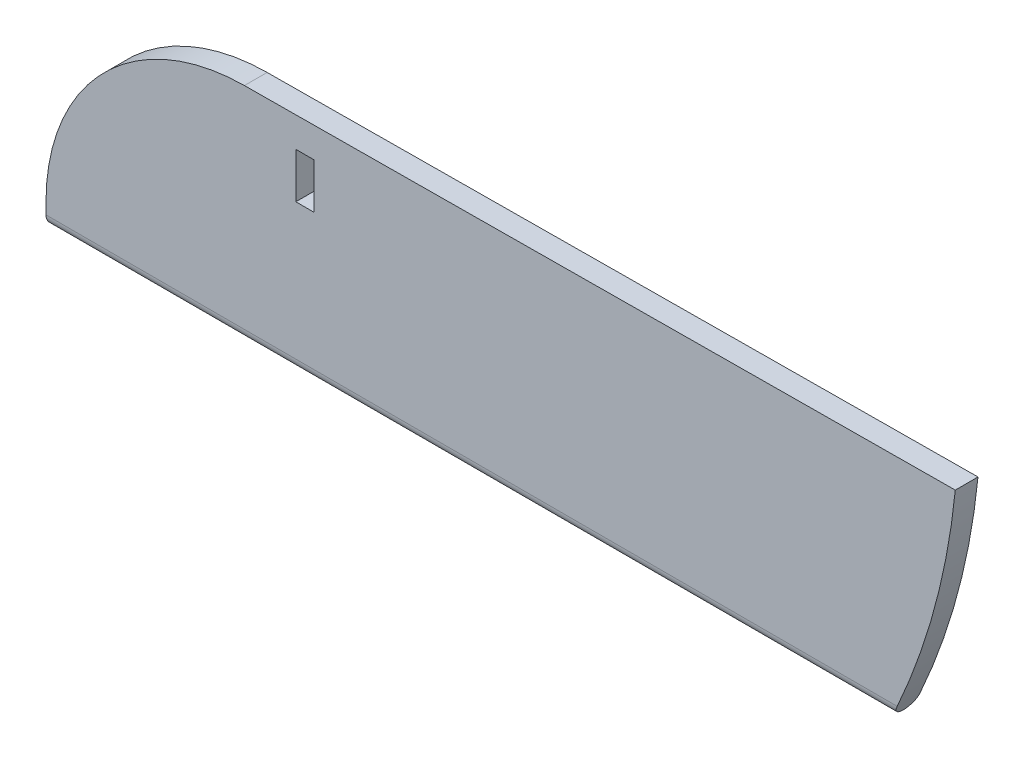
ISO-10303-21;
HEADER;
FILE_DESCRIPTION(('STEP AP214'),'2;1');
FILE_NAME('part.step','',(''),(''),'','','');
FILE_SCHEMA(('AUTOMOTIVE_DESIGN { 1 0 10303 214 1 1 1 1 }'));
ENDSEC;
DATA;
#1=APPLICATION_CONTEXT('core data for automotive mechanical design processes');
#2=APPLICATION_PROTOCOL_DEFINITION('international standard','automotive_design',2000,#1);
#3=PRODUCT_CONTEXT('',#1,'mechanical');
#4=PRODUCT('Part','Part','',(#3));
#5=PRODUCT_RELATED_PRODUCT_CATEGORY('part','',(#4));
#6=PRODUCT_DEFINITION_FORMATION('','',#4);
#7=PRODUCT_DEFINITION_CONTEXT('part definition',#1,'design');
#8=PRODUCT_DEFINITION('design','',#6,#7);
#9=PRODUCT_DEFINITION_SHAPE('','',#8);
#10=(LENGTH_UNIT() NAMED_UNIT(*) SI_UNIT(.MILLI.,.METRE.));
#11=(NAMED_UNIT(*) PLANE_ANGLE_UNIT() SI_UNIT($,.RADIAN.));
#12=(NAMED_UNIT(*) SI_UNIT($,.STERADIAN.) SOLID_ANGLE_UNIT());
#13=UNCERTAINTY_MEASURE_WITH_UNIT(LENGTH_MEASURE(1.E-05),#10,'distance_accuracy_value','');
#14=(GEOMETRIC_REPRESENTATION_CONTEXT(3) GLOBAL_UNCERTAINTY_ASSIGNED_CONTEXT((#13)) GLOBAL_UNIT_ASSIGNED_CONTEXT((#10,
#11,#12)) REPRESENTATION_CONTEXT('',''));
#15=CARTESIAN_POINT('',(0.,0.,0.));
#16=DIRECTION('',(0.,0.,1.));
#17=DIRECTION('',(1.,0.,0.));
#18=AXIS2_PLACEMENT_3D('',#15,#16,#17);
#19=CARTESIAN_POINT('',(0.,0.,5.));
#20=DIRECTION('',(1.,0.,0.));
#21=DIRECTION('',(0.,1.,0.));
#22=AXIS2_PLACEMENT_3D('',#19,#20,#21);
#23=PLANE('',#22);
#24=DIRECTION('',(0.,-1.,0.));
#25=VECTOR('',#24,1.);
#26=CARTESIAN_POINT('',(0.,0.,0.));
#27=LINE('',#26,#25);
#28=CARTESIAN_POINT('',(0.,0.,0.));
#29=VERTEX_POINT('',#28);
#30=CARTESIAN_POINT('',(0.,-2.5,0.));
#31=VERTEX_POINT('',#30);
#32=EDGE_CURVE('E171',#29,#31,#27,.T.);
#33=ORIENTED_EDGE('',*,*,#32,.T.);
#34=CARTESIAN_POINT('',(0.,-2.5,2.5));
#35=DIRECTION('',(1.,0.,0.));
#36=DIRECTION('',(0.,1.,0.));
#37=AXIS2_PLACEMENT_3D('',#34,#35,#36);
#38=CIRCLE('',#37,2.5);
#39=CARTESIAN_POINT('',(0.,-5.,2.5));
#40=VERTEX_POINT('',#39);
#41=EDGE_CURVE('E47',#31,#40,#38,.F.);
#42=ORIENTED_EDGE('',*,*,#41,.T.);
#43=CARTESIAN_POINT('',(0.,-2.5,2.5));
#44=DIRECTION('',(1.,0.,0.));
#45=DIRECTION('',(0.,1.,0.));
#46=AXIS2_PLACEMENT_3D('',#43,#44,#45);
#47=CIRCLE('',#46,2.5);
#48=CARTESIAN_POINT('',(0.,-2.5,5.));
#49=VERTEX_POINT('',#48);
#50=EDGE_CURVE('E238',#40,#49,#47,.F.);
#51=ORIENTED_EDGE('',*,*,#50,.T.);
#52=DIRECTION('',(0.,-1.,0.));
#53=VECTOR('',#52,1.);
#54=CARTESIAN_POINT('',(0.,0.,5.));
#55=LINE('',#54,#53);
#56=CARTESIAN_POINT('',(0.,0.,5.));
#57=VERTEX_POINT('',#56);
#58=EDGE_CURVE('E155',#57,#49,#55,.T.);
#59=ORIENTED_EDGE('',*,*,#58,.F.);
#60=DIRECTION('',(0.,0.,-1.));
#61=VECTOR('',#60,1.);
#62=CARTESIAN_POINT('',(0.,0.,5.));
#63=LINE('',#62,#61);
#64=EDGE_CURVE('E187',#57,#29,#63,.T.);
#65=ORIENTED_EDGE('',*,*,#64,.T.);
#66=EDGE_LOOP('',(#33,#42,#51,#59,#65));
#67=FACE_BOUND('',#66,.T.);
#68=ADVANCED_FACE('F36',(#67),#23,.F.);
#69=CARTESIAN_POINT('',(49.0804526377718,60.1702237350326,5.));
#70=DIRECTION('',(0.,0.,-1.));
#71=DIRECTION('',(-1.,0.,0.));
#72=AXIS2_PLACEMENT_3D('',#69,#70,#71);
#73=CYLINDRICAL_SURFACE('',#72,151.849484724224);
#74=CARTESIAN_POINT('',(187.394259135943,-2.5,5.));
#75=CARTESIAN_POINT('',(187.359794483021,-2.57606470706111,4.99999517680026));
#76=CARTESIAN_POINT('',(187.325282751861,-2.65206443171006,4.99652679560092));
#77=CARTESIAN_POINT('',(187.2563697593,-2.80349177779359,4.98267680963179));
#78=CARTESIAN_POINT('',(187.221968510734,-2.87891933405301,4.97229442890847));
#79=CARTESIAN_POINT('',(187.119159868317,-3.10385006966691,4.93076223164263));
#80=CARTESIAN_POINT('',(187.051238549974,-3.25180058540023,4.88922742363126));
#81=CARTESIAN_POINT('',(186.918817355476,-3.53908747225454,4.77903992870299));
#82=CARTESIAN_POINT('',(186.85432202857,-3.67841242849665,4.71035215943067));
#83=CARTESIAN_POINT('',(186.731089289564,-3.94365615715796,4.54696582324694));
#84=CARTESIAN_POINT('',(186.672346466226,-4.06958753836955,4.45229202591552));
#85=CARTESIAN_POINT('',(186.565647475271,-4.29761577054106,4.24392229898299));
#86=CARTESIAN_POINT('',(186.517307518504,-4.40056966683908,4.13136508894245));
#87=CARTESIAN_POINT('',(186.430212561474,-4.58562500752923,3.88695431555423));
#88=CARTESIAN_POINT('',(186.391455110515,-4.66773178365034,3.75510569968072));
#89=CARTESIAN_POINT('',(186.328835306045,-4.80017224553565,3.4894580906721));
#90=CARTESIAN_POINT('',(186.303897517641,-4.85280523854605,3.35707134181449));
#91=CARTESIAN_POINT('',(186.274674350868,-4.91442910341482,3.1524025847755));
#92=CARTESIAN_POINT('',(186.266298956639,-4.93207913265103,3.08319422954037));
#93=CARTESIAN_POINT('',(186.252368496211,-4.96142587168992,2.94326024413808));
#94=CARTESIAN_POINT('',(186.246811818713,-4.97312598273032,2.87253550495721));
#95=CARTESIAN_POINT('',(186.23982386287,-4.98783747534909,2.75139942690868));
#96=CARTESIAN_POINT('',(186.237656833238,-4.9923987390852,2.70121098227974));
#97=CARTESIAN_POINT('',(186.234767975319,-4.9984788653328,2.60068425965978));
#98=CARTESIAN_POINT('',(186.234043990601,-5.00000226750836,2.55034631798751));
#99=CARTESIAN_POINT('',(186.234045187651,-5.,2.5));
#100=B_SPLINE_CURVE_WITH_KNOTS('',3,(#74,#75,#76,#77,#78,#79,#80,#81,#82,#83,#84,#85,#86,#87,
#88,#89,#90,#91,#92,#93,#94,#95,#96,#97,#98,#99),.UNSPECIFIED.,.F.,.F.,(4,2,2,2,2,2,2,2,2,2,2,2,
4),(0.,0.250373729561682,0.500775563135547,1.00223220206541,1.50433886519763,2.00596857825435,
2.48338583701662,2.96068087125756,3.39198273344927,3.60745874812192,3.82281144827283,
3.97403198918003,4.12502638204572),.UNSPECIFIED.);
#101=CARTESIAN_POINT('',(187.394259135943,-2.50000000000001,5.));
#102=VERTEX_POINT('',#101);
#103=CARTESIAN_POINT('',(186.234045187651,-5.,2.5));
#104=VERTEX_POINT('',#103);
#105=EDGE_CURVE('E191',#102,#104,#100,.T.);
#106=ORIENTED_EDGE('',*,*,#105,.T.);
#107=CARTESIAN_POINT('',(186.234045187651,-5.,2.5));
#108=CARTESIAN_POINT('',(186.234040112923,-5.0000099049446,2.43451276168329));
#109=CARTESIAN_POINT('',(186.235267735078,-4.99742707624972,2.36903098110991));
#110=CARTESIAN_POINT('',(186.240149558864,-4.9871519841549,2.23857687139026));
#111=CARTESIAN_POINT('',(186.2438031402,-4.97946102685491,2.17360441630998));
#112=CARTESIAN_POINT('',(186.253481755268,-4.95908006658725,2.04485101893816));
#113=CARTESIAN_POINT('',(186.259498749096,-4.94640701169307,1.98106679705422));
#114=CARTESIAN_POINT('',(186.273825576072,-4.9162165607908,1.85493492430209));
#115=CARTESIAN_POINT('',(186.282135474528,-4.89869902679807,1.79258731440754));
#116=CARTESIAN_POINT('',(186.310361931994,-4.83915987447348,1.60841232579513));
#117=CARTESIAN_POINT('',(186.333589505332,-4.79012176694773,1.48926700876581));
#118=CARTESIAN_POINT('',(186.387867212102,-4.67531520771474,1.261316915977));
#119=CARTESIAN_POINT('',(186.418921980195,-4.60953684349405,1.15251831950266));
#120=CARTESIAN_POINT('',(186.489069142699,-4.46061367329261,0.943364054443122));
#121=CARTESIAN_POINT('',(186.528433063111,-4.37688009021921,0.843519281464168));
#122=CARTESIAN_POINT('',(186.612999052594,-4.19649599159551,0.659198432539603));
#123=CARTESIAN_POINT('',(186.658202650881,-4.09984209241889,0.574726396201125));
#124=CARTESIAN_POINT('',(186.757475468948,-3.88692567305789,0.415366758553097));
#125=CARTESIAN_POINT('',(186.811977492421,-3.76967799567713,0.342065699154362));
#126=CARTESIAN_POINT('',(186.924761499807,-3.52616998136939,0.216191164788417));
#127=CARTESIAN_POINT('',(186.98304575673,-3.39990422017007,0.163630290934374));
#128=CARTESIAN_POINT('',(187.099866309528,-3.14585813539599,0.0813050351798115));
#129=CARTESIAN_POINT('',(187.158328432558,-3.0182710192045,0.0508344752756559));
#130=CARTESIAN_POINT('',(187.276013761188,-2.76047947883601,0.0101830797203997));
#131=CARTESIAN_POINT('',(187.335235697296,-2.63027925592564,-2.80427262409091E-05));
#132=CARTESIAN_POINT('',(187.394259135943,-2.5,0.));
#133=B_SPLINE_CURVE_WITH_KNOTS('',3,(#107,#108,#109,#110,#111,#112,#113,#114,#115,#116,#117,
#118,#119,#120,#121,#122,#123,#124,#125,#126,#127,#128,#129,#130,#131,#132),.UNSPECIFIED.,.F.,
.F.,(4,2,2,2,2,2,2,2,2,2,2,2,4),(0.,0.196390059372811,0.392729922995501,0.588407579237476,
0.78409080951376,1.17489830038164,1.56593774317153,1.97259824880472,2.37936546179448,
2.82338995389202,3.26768380806189,3.69705965113891,4.12579311475734),.UNSPECIFIED.);
#134=CARTESIAN_POINT('',(187.394259135943,-2.50000000000001,0.));
#135=VERTEX_POINT('',#134);
#136=EDGE_CURVE('E198',#104,#135,#133,.T.);
#137=ORIENTED_EDGE('',*,*,#136,.T.);
#138=CARTESIAN_POINT('',(49.0804526377718,60.1702237350326,0.));
#139=DIRECTION('',(0.,0.,1.));
#140=DIRECTION('',(1.,0.,0.));
#141=AXIS2_PLACEMENT_3D('',#138,#139,#140);
#142=CIRCLE('',#141,151.849484724224);
#143=CARTESIAN_POINT('',(200.182925478254,45.1266632354799,0.));
#144=VERTEX_POINT('',#143);
#145=EDGE_CURVE('E175',#135,#144,#142,.T.);
#146=ORIENTED_EDGE('',*,*,#145,.T.);
#147=DIRECTION('',(0.,0.,-1.));
#148=VECTOR('',#147,1.);
#149=CARTESIAN_POINT('',(200.182925478254,45.1266632354799,5.));
#150=LINE('',#149,#148);
#151=CARTESIAN_POINT('',(200.182925478254,45.1266632354799,5.));
#152=VERTEX_POINT('',#151);
#153=EDGE_CURVE('E183',#152,#144,#150,.T.);
#154=ORIENTED_EDGE('',*,*,#153,.F.);
#155=CARTESIAN_POINT('',(49.0804526377718,60.1702237350326,5.));
#156=DIRECTION('',(0.,0.,1.));
#157=DIRECTION('',(1.,0.,0.));
#158=AXIS2_PLACEMENT_3D('',#155,#156,#157);
#159=CIRCLE('',#158,151.849484724224);
#160=EDGE_CURVE('E160',#102,#152,#159,.T.);
#161=ORIENTED_EDGE('',*,*,#160,.F.);
#162=EDGE_LOOP('',(#106,#137,#146,#154,#161));
#163=FACE_BOUND('',#162,.T.);
#164=ADVANCED_FACE('F203',(#163),#73,.T.);
#165=CARTESIAN_POINT('',(44.,0.,5.));
#166=DIRECTION('',(0.,0.,-1.));
#167=DIRECTION('',(-1.,0.,0.));
#168=AXIS2_PLACEMENT_3D('',#165,#166,#167);
#169=PLANE('',#168);
#170=DIRECTION('',(1.,0.,0.));
#171=VECTOR('',#170,1.);
#172=CARTESIAN_POINT('',(59.,27.5,5.));
#173=LINE('',#172,#171);
#174=CARTESIAN_POINT('',(55.,27.5,5.));
#175=VERTEX_POINT('',#174);
#176=CARTESIAN_POINT('',(59.,27.5,5.));
#177=VERTEX_POINT('',#176);
#178=EDGE_CURVE('E142',#175,#177,#173,.T.);
#179=ORIENTED_EDGE('',*,*,#178,.F.);
#180=DIRECTION('',(0.,-1.,0.));
#181=VECTOR('',#180,1.);
#182=CARTESIAN_POINT('',(55.,27.5,5.));
#183=LINE('',#182,#181);
#184=CARTESIAN_POINT('',(55.,37.5,5.));
#185=VERTEX_POINT('',#184);
#186=EDGE_CURVE('E54',#185,#175,#183,.T.);
#187=ORIENTED_EDGE('',*,*,#186,.F.);
#188=DIRECTION('',(-1.,0.,0.));
#189=VECTOR('',#188,1.);
#190=CARTESIAN_POINT('',(59.,37.5,5.));
#191=LINE('',#190,#189);
#192=CARTESIAN_POINT('',(59.,37.5,5.));
#193=VERTEX_POINT('',#192);
#194=EDGE_CURVE('E133',#193,#185,#191,.T.);
#195=ORIENTED_EDGE('',*,*,#194,.F.);
#196=DIRECTION('',(0.,1.,0.));
#197=VECTOR('',#196,1.);
#198=CARTESIAN_POINT('',(59.,27.5,5.));
#199=LINE('',#198,#197);
#200=EDGE_CURVE('E136',#177,#193,#199,.T.);
#201=ORIENTED_EDGE('',*,*,#200,.F.);
#202=EDGE_LOOP('',(#179,#187,#195,#201));
#203=FACE_BOUND('',#202,.T.);
#204=ORIENTED_EDGE('',*,*,#58,.T.);
#205=DIRECTION('',(1.,0.,0.));
#206=VECTOR('',#205,1.);
#207=CARTESIAN_POINT('',(186.234045187651,-2.5,5.));
#208=LINE('',#207,#206);
#209=EDGE_CURVE('E11',#49,#102,#208,.T.);
#210=ORIENTED_EDGE('',*,*,#209,.T.);
#211=ORIENTED_EDGE('',*,*,#160,.T.);
#212=DIRECTION('',(-0.999974034721699,-0.00720623913058243,0.));
#213=VECTOR('',#212,1.);
#214=CARTESIAN_POINT('',(43.6829254782544,43.9988575277547,5.));
#215=LINE('',#214,#213);
#216=CARTESIAN_POINT('',(43.6829254782544,43.9988575277547,5.));
#217=VERTEX_POINT('',#216);
#218=EDGE_CURVE('E163',#152,#217,#215,.T.);
#219=ORIENTED_EDGE('',*,*,#218,.T.);
#220=CARTESIAN_POINT('',(44.,0.,5.));
#221=DIRECTION('',(0.,0.,1.));
#222=DIRECTION('',(-1.,0.,0.));
#223=AXIS2_PLACEMENT_3D('',#220,#221,#222);
#224=CIRCLE('',#223,44.);
#225=EDGE_CURVE('E151',#217,#57,#224,.T.);
#226=ORIENTED_EDGE('',*,*,#225,.T.);
#227=EDGE_LOOP('',(#204,#210,#211,#219,#226));
#228=FACE_BOUND('',#227,.T.);
#229=ADVANCED_FACE('F208',(#203,#228),#169,.F.);
#230=CARTESIAN_POINT('',(44.,0.,0.));
#231=DIRECTION('',(0.,0.,-1.));
#232=DIRECTION('',(-1.,0.,0.));
#233=AXIS2_PLACEMENT_3D('',#230,#231,#232);
#234=PLANE('',#233);
#235=DIRECTION('',(0.,-1.,0.));
#236=VECTOR('',#235,1.);
#237=CARTESIAN_POINT('',(55.,27.5,0.));
#238=LINE('',#237,#236);
#239=CARTESIAN_POINT('',(55.,37.5,0.));
#240=VERTEX_POINT('',#239);
#241=CARTESIAN_POINT('',(55.,27.5,0.));
#242=VERTEX_POINT('',#241);
#243=EDGE_CURVE('E117',#240,#242,#238,.T.);
#244=ORIENTED_EDGE('',*,*,#243,.T.);
#245=DIRECTION('',(1.,0.,0.));
#246=VECTOR('',#245,1.);
#247=CARTESIAN_POINT('',(59.,27.5,0.));
#248=LINE('',#247,#246);
#249=CARTESIAN_POINT('',(59.,27.5,0.));
#250=VERTEX_POINT('',#249);
#251=EDGE_CURVE('E126',#242,#250,#248,.T.);
#252=ORIENTED_EDGE('',*,*,#251,.T.);
#253=DIRECTION('',(0.,1.,0.));
#254=VECTOR('',#253,1.);
#255=CARTESIAN_POINT('',(59.,27.5,0.));
#256=LINE('',#255,#254);
#257=CARTESIAN_POINT('',(59.,37.5,0.));
#258=VERTEX_POINT('',#257);
#259=EDGE_CURVE('E62',#250,#258,#256,.T.);
#260=ORIENTED_EDGE('',*,*,#259,.T.);
#261=DIRECTION('',(-1.,0.,0.));
#262=VECTOR('',#261,1.);
#263=CARTESIAN_POINT('',(59.,37.5,0.));
#264=LINE('',#263,#262);
#265=EDGE_CURVE('E123',#258,#240,#264,.T.);
#266=ORIENTED_EDGE('',*,*,#265,.T.);
#267=EDGE_LOOP('',(#244,#252,#260,#266));
#268=FACE_BOUND('',#267,.T.);
#269=ORIENTED_EDGE('',*,*,#145,.F.);
#270=DIRECTION('',(1.,0.,0.));
#271=VECTOR('',#270,1.);
#272=CARTESIAN_POINT('',(44.,-2.5,0.));
#273=LINE('',#272,#271);
#274=EDGE_CURVE('E234',#135,#31,#273,.F.);
#275=ORIENTED_EDGE('',*,*,#274,.T.);
#276=ORIENTED_EDGE('',*,*,#32,.F.);
#277=CARTESIAN_POINT('',(44.,0.,0.));
#278=DIRECTION('',(0.,0.,1.));
#279=DIRECTION('',(-1.,0.,0.));
#280=AXIS2_PLACEMENT_3D('',#277,#278,#279);
#281=CIRCLE('',#280,44.);
#282=CARTESIAN_POINT('',(43.6829254782544,43.9988575277547,0.));
#283=VERTEX_POINT('',#282);
#284=EDGE_CURVE('E167',#283,#29,#281,.T.);
#285=ORIENTED_EDGE('',*,*,#284,.F.);
#286=DIRECTION('',(-0.999974034721699,-0.00720623913058243,0.));
#287=VECTOR('',#286,1.);
#288=CARTESIAN_POINT('',(43.6829254782544,43.9988575277547,0.));
#289=LINE('',#288,#287);
#290=EDGE_CURVE('E156',#144,#283,#289,.T.);
#291=ORIENTED_EDGE('',*,*,#290,.F.);
#292=EDGE_LOOP('',(#269,#275,#276,#285,#291));
#293=FACE_BOUND('',#292,.T.);
#294=ADVANCED_FACE('F130',(#268,#293),#234,.T.);
#295=CARTESIAN_POINT('',(44.,0.,5.));
#296=DIRECTION('',(0.,0.,-1.));
#297=DIRECTION('',(-1.,0.,0.));
#298=AXIS2_PLACEMENT_3D('',#295,#296,#297);
#299=CYLINDRICAL_SURFACE('',#298,44.);
#300=ORIENTED_EDGE('',*,*,#284,.T.);
#301=ORIENTED_EDGE('',*,*,#64,.F.);
#302=ORIENTED_EDGE('',*,*,#225,.F.);
#303=DIRECTION('',(0.,0.,-1.));
#304=VECTOR('',#303,1.);
#305=CARTESIAN_POINT('',(43.6829254782544,43.9988575277547,5.));
#306=LINE('',#305,#304);
#307=EDGE_CURVE('E166',#217,#283,#306,.T.);
#308=ORIENTED_EDGE('',*,*,#307,.T.);
#309=EDGE_LOOP('',(#300,#301,#302,#308));
#310=FACE_BOUND('',#309,.T.);
#311=ADVANCED_FACE('F216',(#310),#299,.T.);
#312=CARTESIAN_POINT('',(43.6829254782544,43.9988575277547,5.));
#313=DIRECTION('',(0.00720623913058243,-0.999974034721699,0.));
#314=DIRECTION('',(0.999974034721699,0.00720623913058243,0.));
#315=AXIS2_PLACEMENT_3D('',#312,#313,#314);
#316=PLANE('',#315);
#317=ORIENTED_EDGE('',*,*,#290,.T.);
#318=ORIENTED_EDGE('',*,*,#307,.F.);
#319=ORIENTED_EDGE('',*,*,#218,.F.);
#320=ORIENTED_EDGE('',*,*,#153,.T.);
#321=EDGE_LOOP('',(#317,#318,#319,#320));
#322=FACE_BOUND('',#321,.T.);
#323=ADVANCED_FACE('F210',(#322),#316,.F.);
#324=CARTESIAN_POINT('',(44.,-2.5,2.5));
#325=DIRECTION('',(-1.,0.,0.));
#326=DIRECTION('',(0.,0.,1.));
#327=AXIS2_PLACEMENT_3D('',#324,#325,#326);
#328=CYLINDRICAL_SURFACE('',#327,2.5);
#329=ORIENTED_EDGE('',*,*,#209,.F.);
#330=ORIENTED_EDGE('',*,*,#50,.F.);
#331=DIRECTION('',(1.,0.,0.));
#332=VECTOR('',#331,1.);
#333=CARTESIAN_POINT('',(0.,-5.,2.5));
#334=LINE('',#333,#332);
#335=EDGE_CURVE('E41',#104,#40,#334,.F.);
#336=ORIENTED_EDGE('',*,*,#335,.F.);
#337=ORIENTED_EDGE('',*,*,#105,.F.);
#338=EDGE_LOOP('',(#329,#330,#336,#337));
#339=FACE_BOUND('',#338,.T.);
#340=ADVANCED_FACE('F38',(#339),#328,.T.);
#341=CARTESIAN_POINT('',(0.,-2.5,2.5));
#342=DIRECTION('',(1.,0.,0.));
#343=DIRECTION('',(0.,0.,-1.));
#344=AXIS2_PLACEMENT_3D('',#341,#342,#343);
#345=CYLINDRICAL_SURFACE('',#344,2.5);
#346=ORIENTED_EDGE('',*,*,#41,.F.);
#347=ORIENTED_EDGE('',*,*,#274,.F.);
#348=ORIENTED_EDGE('',*,*,#136,.F.);
#349=ORIENTED_EDGE('',*,*,#335,.T.);
#350=EDGE_LOOP('',(#346,#347,#348,#349));
#351=FACE_BOUND('',#350,.T.);
#352=ADVANCED_FACE('F219',(#351),#345,.T.);
#353=CARTESIAN_POINT('',(55.,27.5,0.));
#354=DIRECTION('',(-1.,0.,0.));
#355=DIRECTION('',(0.,0.,1.));
#356=AXIS2_PLACEMENT_3D('',#353,#354,#355);
#357=PLANE('',#356);
#358=ORIENTED_EDGE('',*,*,#186,.T.);
#359=DIRECTION('',(0.,0.,1.));
#360=VECTOR('',#359,1.);
#361=CARTESIAN_POINT('',(55.,27.5,0.));
#362=LINE('',#361,#360);
#363=EDGE_CURVE('E113',#242,#175,#362,.T.);
#364=ORIENTED_EDGE('',*,*,#363,.F.);
#365=ORIENTED_EDGE('',*,*,#243,.F.);
#366=DIRECTION('',(0.,0.,1.));
#367=VECTOR('',#366,1.);
#368=CARTESIAN_POINT('',(55.,37.5,0.));
#369=LINE('',#368,#367);
#370=EDGE_CURVE('E146',#240,#185,#369,.T.);
#371=ORIENTED_EDGE('',*,*,#370,.T.);
#372=EDGE_LOOP('',(#358,#364,#365,#371));
#373=FACE_BOUND('',#372,.T.);
#374=ADVANCED_FACE('F115',(#373),#357,.F.);
#375=CARTESIAN_POINT('',(59.,37.5,0.));
#376=DIRECTION('',(0.,1.,0.));
#377=DIRECTION('',(0.,0.,1.));
#378=AXIS2_PLACEMENT_3D('',#375,#376,#377);
#379=PLANE('',#378);
#380=ORIENTED_EDGE('',*,*,#194,.T.);
#381=ORIENTED_EDGE('',*,*,#370,.F.);
#382=ORIENTED_EDGE('',*,*,#265,.F.);
#383=DIRECTION('',(0.,0.,1.));
#384=VECTOR('',#383,1.);
#385=CARTESIAN_POINT('',(59.,37.5,0.));
#386=LINE('',#385,#384);
#387=EDGE_CURVE('E148',#258,#193,#386,.T.);
#388=ORIENTED_EDGE('',*,*,#387,.T.);
#389=EDGE_LOOP('',(#380,#381,#382,#388));
#390=FACE_BOUND('',#389,.T.);
#391=ADVANCED_FACE('F227',(#390),#379,.F.);
#392=CARTESIAN_POINT('',(59.,27.5,0.));
#393=DIRECTION('',(1.,0.,0.));
#394=DIRECTION('',(0.,0.,-1.));
#395=AXIS2_PLACEMENT_3D('',#392,#393,#394);
#396=PLANE('',#395);
#397=ORIENTED_EDGE('',*,*,#200,.T.);
#398=ORIENTED_EDGE('',*,*,#387,.F.);
#399=ORIENTED_EDGE('',*,*,#259,.F.);
#400=DIRECTION('',(0.,0.,1.));
#401=VECTOR('',#400,1.);
#402=CARTESIAN_POINT('',(59.,27.5,0.));
#403=LINE('',#402,#401);
#404=EDGE_CURVE('E122',#250,#177,#403,.T.);
#405=ORIENTED_EDGE('',*,*,#404,.T.);
#406=EDGE_LOOP('',(#397,#398,#399,#405));
#407=FACE_BOUND('',#406,.T.);
#408=ADVANCED_FACE('F364',(#407),#396,.F.);
#409=CARTESIAN_POINT('',(59.,27.5,0.));
#410=DIRECTION('',(0.,-1.,0.));
#411=DIRECTION('',(1.,0.,0.));
#412=AXIS2_PLACEMENT_3D('',#409,#410,#411);
#413=PLANE('',#412);
#414=ORIENTED_EDGE('',*,*,#178,.T.);
#415=ORIENTED_EDGE('',*,*,#404,.F.);
#416=ORIENTED_EDGE('',*,*,#251,.F.);
#417=ORIENTED_EDGE('',*,*,#363,.T.);
#418=EDGE_LOOP('',(#414,#415,#416,#417));
#419=FACE_BOUND('',#418,.T.);
#420=ADVANCED_FACE('F127',(#419),#413,.F.);
#421=CLOSED_SHELL('',(#68,#164,#229,#294,#311,#323,#340,#352,#374,#391,#408,#420));
#422=MANIFOLD_SOLID_BREP('B2',#421);
#423=ADVANCED_BREP_SHAPE_REPRESENTATION('',(#18,#422),#14);
#424=SHAPE_DEFINITION_REPRESENTATION(#9,#423);
ENDSEC;
END-ISO-10303-21;
